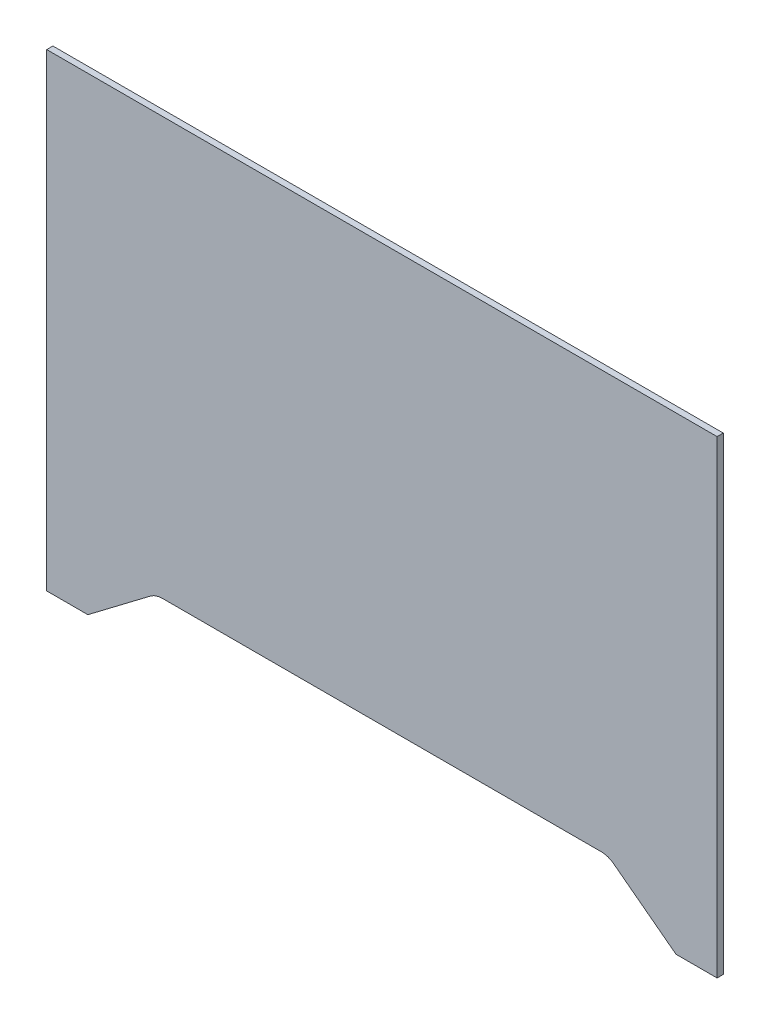
ISO-10303-21;
HEADER;
FILE_DESCRIPTION(('STEP AP214'),'2;1');
FILE_NAME('part.step','',(''),(''),'','','');
FILE_SCHEMA(('AUTOMOTIVE_DESIGN { 1 0 10303 214 1 1 1 1 }'));
ENDSEC;
DATA;
#1=APPLICATION_CONTEXT('core data for automotive mechanical design processes');
#2=APPLICATION_PROTOCOL_DEFINITION('international standard','automotive_design',2000,#1);
#3=PRODUCT_CONTEXT('',#1,'mechanical');
#4=PRODUCT('Part','Part','',(#3));
#5=PRODUCT_RELATED_PRODUCT_CATEGORY('part','',(#4));
#6=PRODUCT_DEFINITION_FORMATION('','',#4);
#7=PRODUCT_DEFINITION_CONTEXT('part definition',#1,'design');
#8=PRODUCT_DEFINITION('design','',#6,#7);
#9=PRODUCT_DEFINITION_SHAPE('','',#8);
#10=(LENGTH_UNIT() NAMED_UNIT(*) SI_UNIT(.MILLI.,.METRE.));
#11=(NAMED_UNIT(*) PLANE_ANGLE_UNIT() SI_UNIT($,.RADIAN.));
#12=(NAMED_UNIT(*) SI_UNIT($,.STERADIAN.) SOLID_ANGLE_UNIT());
#13=UNCERTAINTY_MEASURE_WITH_UNIT(LENGTH_MEASURE(1.E-05),#10,'distance_accuracy_value','');
#14=(GEOMETRIC_REPRESENTATION_CONTEXT(3) GLOBAL_UNCERTAINTY_ASSIGNED_CONTEXT((#13)) GLOBAL_UNIT_ASSIGNED_CONTEXT((#10,
#11,#12)) REPRESENTATION_CONTEXT('',''));
#15=CARTESIAN_POINT('',(0.,0.,0.));
#16=DIRECTION('',(0.,0.,1.));
#17=DIRECTION('',(1.,0.,0.));
#18=AXIS2_PLACEMENT_3D('',#15,#16,#17);
#19=CARTESIAN_POINT('',(163.,-114.,3.));
#20=DIRECTION('',(-1.,0.,0.));
#21=DIRECTION('',(0.,0.,1.));
#22=AXIS2_PLACEMENT_3D('',#19,#20,#21);
#23=PLANE('',#22);
#24=DIRECTION('',(0.,1.,0.));
#25=VECTOR('',#24,1.);
#26=CARTESIAN_POINT('',(163.,-114.,0.));
#27=LINE('',#26,#25);
#28=CARTESIAN_POINT('',(163.,-114.,0.));
#29=VERTEX_POINT('',#28);
#30=CARTESIAN_POINT('',(163.,114.,0.));
#31=VERTEX_POINT('',#30);
#32=EDGE_CURVE('E147',#29,#31,#27,.T.);
#33=ORIENTED_EDGE('',*,*,#32,.T.);
#34=DIRECTION('',(0.,0.,-1.));
#35=VECTOR('',#34,1.);
#36=CARTESIAN_POINT('',(163.,114.,3.));
#37=LINE('',#36,#35);
#38=CARTESIAN_POINT('',(163.,114.,3.));
#39=VERTEX_POINT('',#38);
#40=EDGE_CURVE('E11',#39,#31,#37,.T.);
#41=ORIENTED_EDGE('',*,*,#40,.F.);
#42=DIRECTION('',(0.,1.,0.));
#43=VECTOR('',#42,1.);
#44=CARTESIAN_POINT('',(163.,-114.,3.));
#45=LINE('',#44,#43);
#46=CARTESIAN_POINT('',(163.,-114.,3.));
#47=VERTEX_POINT('',#46);
#48=EDGE_CURVE('E165',#47,#39,#45,.T.);
#49=ORIENTED_EDGE('',*,*,#48,.F.);
#50=DIRECTION('',(0.,0.,-1.));
#51=VECTOR('',#50,1.);
#52=CARTESIAN_POINT('',(163.,-114.,3.));
#53=LINE('',#52,#51);
#54=EDGE_CURVE('E143',#47,#29,#53,.T.);
#55=ORIENTED_EDGE('',*,*,#54,.T.);
#56=EDGE_LOOP('',(#33,#41,#49,#55));
#57=FACE_BOUND('',#56,.T.);
#58=ADVANCED_FACE('F39',(#57),#23,.F.);
#59=CARTESIAN_POINT('',(-163.,114.,3.));
#60=DIRECTION('',(0.,-1.,0.));
#61=DIRECTION('',(0.,0.,-1.));
#62=AXIS2_PLACEMENT_3D('',#59,#60,#61);
#63=PLANE('',#62);
#64=DIRECTION('',(-1.,0.,0.));
#65=VECTOR('',#64,1.);
#66=CARTESIAN_POINT('',(-163.,114.,0.));
#67=LINE('',#66,#65);
#68=CARTESIAN_POINT('',(-163.,114.,0.));
#69=VERTEX_POINT('',#68);
#70=EDGE_CURVE('E150',#31,#69,#67,.T.);
#71=ORIENTED_EDGE('',*,*,#70,.T.);
#72=DIRECTION('',(0.,0.,-1.));
#73=VECTOR('',#72,1.);
#74=CARTESIAN_POINT('',(-163.,114.,3.));
#75=LINE('',#74,#73);
#76=CARTESIAN_POINT('',(-163.,114.,3.));
#77=VERTEX_POINT('',#76);
#78=EDGE_CURVE('E47',#77,#69,#75,.T.);
#79=ORIENTED_EDGE('',*,*,#78,.F.);
#80=DIRECTION('',(-1.,0.,0.));
#81=VECTOR('',#80,1.);
#82=CARTESIAN_POINT('',(-163.,114.,3.));
#83=LINE('',#82,#81);
#84=EDGE_CURVE('E104',#39,#77,#83,.T.);
#85=ORIENTED_EDGE('',*,*,#84,.F.);
#86=ORIENTED_EDGE('',*,*,#40,.T.);
#87=EDGE_LOOP('',(#71,#79,#85,#86));
#88=FACE_BOUND('',#87,.T.);
#89=ADVANCED_FACE('F214',(#88),#63,.F.);
#90=CARTESIAN_POINT('',(-163.,-114.,3.));
#91=DIRECTION('',(1.,0.,0.));
#92=DIRECTION('',(0.,0.,-1.));
#93=AXIS2_PLACEMENT_3D('',#90,#91,#92);
#94=PLANE('',#93);
#95=DIRECTION('',(0.,-1.,0.));
#96=VECTOR('',#95,1.);
#97=CARTESIAN_POINT('',(-163.,-114.,0.));
#98=LINE('',#97,#96);
#99=CARTESIAN_POINT('',(-163.,-114.,0.));
#100=VERTEX_POINT('',#99);
#101=EDGE_CURVE('E152',#69,#100,#98,.T.);
#102=ORIENTED_EDGE('',*,*,#101,.T.);
#103=DIRECTION('',(0.,0.,-1.));
#104=VECTOR('',#103,1.);
#105=CARTESIAN_POINT('',(-163.,-114.,3.));
#106=LINE('',#105,#104);
#107=CARTESIAN_POINT('',(-163.,-114.,3.));
#108=VERTEX_POINT('',#107);
#109=EDGE_CURVE('E178',#108,#100,#106,.T.);
#110=ORIENTED_EDGE('',*,*,#109,.F.);
#111=DIRECTION('',(0.,-1.,0.));
#112=VECTOR('',#111,1.);
#113=CARTESIAN_POINT('',(-163.,-114.,3.));
#114=LINE('',#113,#112);
#115=EDGE_CURVE('E186',#77,#108,#114,.T.);
#116=ORIENTED_EDGE('',*,*,#115,.F.);
#117=ORIENTED_EDGE('',*,*,#78,.T.);
#118=EDGE_LOOP('',(#102,#110,#116,#117));
#119=FACE_BOUND('',#118,.T.);
#120=ADVANCED_FACE('F184',(#119),#94,.F.);
#121=CARTESIAN_POINT('',(-143.,-114.,3.));
#122=DIRECTION('',(0.,1.,0.));
#123=DIRECTION('',(0.,0.,1.));
#124=AXIS2_PLACEMENT_3D('',#121,#122,#123);
#125=PLANE('',#124);
#126=DIRECTION('',(1.,0.,0.));
#127=VECTOR('',#126,1.);
#128=CARTESIAN_POINT('',(-143.,-114.,0.));
#129=LINE('',#128,#127);
#130=CARTESIAN_POINT('',(-143.,-114.,0.));
#131=VERTEX_POINT('',#130);
#132=EDGE_CURVE('E154',#100,#131,#129,.T.);
#133=ORIENTED_EDGE('',*,*,#132,.T.);
#134=DIRECTION('',(0.,0.,-1.));
#135=VECTOR('',#134,1.);
#136=CARTESIAN_POINT('',(-143.,-114.,3.));
#137=LINE('',#136,#135);
#138=CARTESIAN_POINT('',(-143.,-114.,3.));
#139=VERTEX_POINT('',#138);
#140=EDGE_CURVE('E175',#139,#131,#137,.T.);
#141=ORIENTED_EDGE('',*,*,#140,.F.);
#142=DIRECTION('',(1.,0.,0.));
#143=VECTOR('',#142,1.);
#144=CARTESIAN_POINT('',(-143.,-114.,3.));
#145=LINE('',#144,#143);
#146=EDGE_CURVE('E204',#108,#139,#145,.T.);
#147=ORIENTED_EDGE('',*,*,#146,.F.);
#148=ORIENTED_EDGE('',*,*,#109,.T.);
#149=EDGE_LOOP('',(#133,#141,#147,#148));
#150=FACE_BOUND('',#149,.T.);
#151=ADVANCED_FACE('F195',(#150),#125,.F.);
#152=CARTESIAN_POINT('',(-112.678383644367,-91.02907851846,3.));
#153=DIRECTION('',(-0.603857687995462,0.797092148154011,0.));
#154=DIRECTION('',(-0.797092148154011,-0.603857687995462,0.));
#155=AXIS2_PLACEMENT_3D('',#152,#153,#154);
#156=PLANE('',#155);
#157=DIRECTION('',(0.797092148154011,0.603857687995462,0.));
#158=VECTOR('',#157,1.);
#159=CARTESIAN_POINT('',(-112.678383644367,-91.02907851846,0.));
#160=LINE('',#159,#158);
#161=CARTESIAN_POINT('',(-112.678383644367,-91.02907851846,0.));
#162=VERTEX_POINT('',#161);
#163=EDGE_CURVE('E156',#131,#162,#160,.T.);
#164=ORIENTED_EDGE('',*,*,#163,.T.);
#165=DIRECTION('',(0.,0.,-1.));
#166=VECTOR('',#165,1.);
#167=CARTESIAN_POINT('',(-112.678383644367,-91.02907851846,3.));
#168=LINE('',#167,#166);
#169=CARTESIAN_POINT('',(-112.678383644367,-91.02907851846,3.));
#170=VERTEX_POINT('',#169);
#171=EDGE_CURVE('E172',#170,#162,#168,.T.);
#172=ORIENTED_EDGE('',*,*,#171,.F.);
#173=DIRECTION('',(0.797092148154011,0.603857687995462,0.));
#174=VECTOR('',#173,1.);
#175=CARTESIAN_POINT('',(-112.678383644367,-91.02907851846,3.));
#176=LINE('',#175,#174);
#177=EDGE_CURVE('E201',#139,#170,#176,.T.);
#178=ORIENTED_EDGE('',*,*,#177,.F.);
#179=ORIENTED_EDGE('',*,*,#140,.T.);
#180=EDGE_LOOP('',(#164,#172,#178,#179));
#181=FACE_BOUND('',#180,.T.);
#182=ADVANCED_FACE('F199',(#181),#156,.F.);
#183=CARTESIAN_POINT('',(-106.639806764412,-99.0000000000001,3.));
#184=DIRECTION('',(0.,0.,-1.));
#185=DIRECTION('',(-1.,0.,0.));
#186=AXIS2_PLACEMENT_3D('',#183,#184,#185);
#187=CYLINDRICAL_SURFACE('',#186,10.);
#188=CARTESIAN_POINT('',(-106.639806764412,-99.0000000000001,0.));
#189=DIRECTION('',(0.,0.,-1.));
#190=DIRECTION('',(-1.,0.,0.));
#191=AXIS2_PLACEMENT_3D('',#188,#189,#190);
#192=CIRCLE('',#191,10.);
#193=CARTESIAN_POINT('',(-106.639806764412,-89.0000000000001,0.));
#194=VERTEX_POINT('',#193);
#195=EDGE_CURVE('E158',#162,#194,#192,.T.);
#196=ORIENTED_EDGE('',*,*,#195,.T.);
#197=DIRECTION('',(0.,0.,-1.));
#198=VECTOR('',#197,1.);
#199=CARTESIAN_POINT('',(-106.639806764412,-89.0000000000001,3.));
#200=LINE('',#199,#198);
#201=CARTESIAN_POINT('',(-106.639806764412,-89.0000000000001,3.));
#202=VERTEX_POINT('',#201);
#203=EDGE_CURVE('E169',#202,#194,#200,.T.);
#204=ORIENTED_EDGE('',*,*,#203,.F.);
#205=CARTESIAN_POINT('',(-106.639806764412,-99.0000000000001,3.));
#206=DIRECTION('',(0.,0.,-1.));
#207=DIRECTION('',(-1.,0.,0.));
#208=AXIS2_PLACEMENT_3D('',#205,#206,#207);
#209=CIRCLE('',#208,10.);
#210=EDGE_CURVE('E203',#170,#202,#209,.T.);
#211=ORIENTED_EDGE('',*,*,#210,.F.);
#212=ORIENTED_EDGE('',*,*,#171,.T.);
#213=EDGE_LOOP('',(#196,#204,#211,#212));
#214=FACE_BOUND('',#213,.T.);
#215=ADVANCED_FACE('F226',(#214),#187,.F.);
#216=CARTESIAN_POINT('',(-106.639806764412,-89.0000000000001,3.));
#217=DIRECTION('',(0.,1.,0.));
#218=DIRECTION('',(0.,0.,1.));
#219=AXIS2_PLACEMENT_3D('',#216,#217,#218);
#220=PLANE('',#219);
#221=DIRECTION('',(1.,0.,0.));
#222=VECTOR('',#221,1.);
#223=CARTESIAN_POINT('',(-106.639806764412,-89.0000000000001,0.));
#224=LINE('',#223,#222);
#225=CARTESIAN_POINT('',(106.639806764412,-89.0000000000001,0.));
#226=VERTEX_POINT('',#225);
#227=EDGE_CURVE('E160',#194,#226,#224,.T.);
#228=ORIENTED_EDGE('',*,*,#227,.T.);
#229=DIRECTION('',(0.,0.,-1.));
#230=VECTOR('',#229,1.);
#231=CARTESIAN_POINT('',(106.639806764412,-89.0000000000001,3.));
#232=LINE('',#231,#230);
#233=CARTESIAN_POINT('',(106.639806764412,-89.0000000000001,3.));
#234=VERTEX_POINT('',#233);
#235=EDGE_CURVE('E138',#234,#226,#232,.T.);
#236=ORIENTED_EDGE('',*,*,#235,.F.);
#237=DIRECTION('',(1.,0.,0.));
#238=VECTOR('',#237,1.);
#239=CARTESIAN_POINT('',(-106.639806764412,-89.0000000000001,3.));
#240=LINE('',#239,#238);
#241=EDGE_CURVE('E129',#202,#234,#240,.T.);
#242=ORIENTED_EDGE('',*,*,#241,.F.);
#243=ORIENTED_EDGE('',*,*,#203,.T.);
#244=EDGE_LOOP('',(#228,#236,#242,#243));
#245=FACE_BOUND('',#244,.T.);
#246=ADVANCED_FACE('F229',(#245),#220,.F.);
#247=CARTESIAN_POINT('',(106.639806764412,-99.0000000000001,3.));
#248=DIRECTION('',(0.,0.,-1.));
#249=DIRECTION('',(-1.,0.,0.));
#250=AXIS2_PLACEMENT_3D('',#247,#248,#249);
#251=CYLINDRICAL_SURFACE('',#250,10.);
#252=CARTESIAN_POINT('',(106.639806764412,-99.0000000000001,0.));
#253=DIRECTION('',(0.,0.,-1.));
#254=DIRECTION('',(1.,0.,0.));
#255=AXIS2_PLACEMENT_3D('',#252,#253,#254);
#256=CIRCLE('',#255,10.);
#257=CARTESIAN_POINT('',(112.678383644367,-91.02907851846,0.));
#258=VERTEX_POINT('',#257);
#259=EDGE_CURVE('E137',#226,#258,#256,.T.);
#260=ORIENTED_EDGE('',*,*,#259,.T.);
#261=DIRECTION('',(0.,0.,-1.));
#262=VECTOR('',#261,1.);
#263=CARTESIAN_POINT('',(112.678383644367,-91.02907851846,3.));
#264=LINE('',#263,#262);
#265=CARTESIAN_POINT('',(112.678383644367,-91.02907851846,3.));
#266=VERTEX_POINT('',#265);
#267=EDGE_CURVE('E134',#266,#258,#264,.T.);
#268=ORIENTED_EDGE('',*,*,#267,.F.);
#269=CARTESIAN_POINT('',(106.639806764412,-99.0000000000001,3.));
#270=DIRECTION('',(0.,0.,-1.));
#271=DIRECTION('',(1.,0.,0.));
#272=AXIS2_PLACEMENT_3D('',#269,#270,#271);
#273=CIRCLE('',#272,10.);
#274=EDGE_CURVE('E123',#234,#266,#273,.T.);
#275=ORIENTED_EDGE('',*,*,#274,.F.);
#276=ORIENTED_EDGE('',*,*,#235,.T.);
#277=EDGE_LOOP('',(#260,#268,#275,#276));
#278=FACE_BOUND('',#277,.T.);
#279=ADVANCED_FACE('F135',(#278),#251,.F.);
#280=CARTESIAN_POINT('',(112.678383644367,-91.02907851846,3.));
#281=DIRECTION('',(0.603857687995462,0.797092148154011,0.));
#282=DIRECTION('',(-0.797092148154011,0.603857687995462,0.));
#283=AXIS2_PLACEMENT_3D('',#280,#281,#282);
#284=PLANE('',#283);
#285=DIRECTION('',(0.797092148154011,-0.603857687995462,0.));
#286=VECTOR('',#285,1.);
#287=CARTESIAN_POINT('',(112.678383644367,-91.02907851846,0.));
#288=LINE('',#287,#286);
#289=CARTESIAN_POINT('',(143.,-114.,0.));
#290=VERTEX_POINT('',#289);
#291=EDGE_CURVE('E90',#258,#290,#288,.T.);
#292=ORIENTED_EDGE('',*,*,#291,.T.);
#293=DIRECTION('',(0.,0.,-1.));
#294=VECTOR('',#293,1.);
#295=CARTESIAN_POINT('',(143.,-114.,3.));
#296=LINE('',#295,#294);
#297=CARTESIAN_POINT('',(143.,-114.,3.));
#298=VERTEX_POINT('',#297);
#299=EDGE_CURVE('E139',#298,#290,#296,.T.);
#300=ORIENTED_EDGE('',*,*,#299,.F.);
#301=DIRECTION('',(0.797092148154011,-0.603857687995462,0.));
#302=VECTOR('',#301,1.);
#303=CARTESIAN_POINT('',(112.678383644367,-91.02907851846,3.));
#304=LINE('',#303,#302);
#305=EDGE_CURVE('E127',#266,#298,#304,.T.);
#306=ORIENTED_EDGE('',*,*,#305,.F.);
#307=ORIENTED_EDGE('',*,*,#267,.T.);
#308=EDGE_LOOP('',(#292,#300,#306,#307));
#309=FACE_BOUND('',#308,.T.);
#310=ADVANCED_FACE('F141',(#309),#284,.F.);
#311=CARTESIAN_POINT('',(143.,-114.,3.));
#312=DIRECTION('',(0.,1.,0.));
#313=DIRECTION('',(0.,0.,1.));
#314=AXIS2_PLACEMENT_3D('',#311,#312,#313);
#315=PLANE('',#314);
#316=DIRECTION('',(1.,0.,0.));
#317=VECTOR('',#316,1.);
#318=CARTESIAN_POINT('',(143.,-114.,0.));
#319=LINE('',#318,#317);
#320=EDGE_CURVE('E96',#290,#29,#319,.T.);
#321=ORIENTED_EDGE('',*,*,#320,.T.);
#322=ORIENTED_EDGE('',*,*,#54,.F.);
#323=DIRECTION('',(1.,0.,0.));
#324=VECTOR('',#323,1.);
#325=CARTESIAN_POINT('',(143.,-114.,3.));
#326=LINE('',#325,#324);
#327=EDGE_CURVE('E55',#298,#47,#326,.T.);
#328=ORIENTED_EDGE('',*,*,#327,.F.);
#329=ORIENTED_EDGE('',*,*,#299,.T.);
#330=EDGE_LOOP('',(#321,#322,#328,#329));
#331=FACE_BOUND('',#330,.T.);
#332=ADVANCED_FACE('F238',(#331),#315,.F.);
#333=CARTESIAN_POINT('',(-106.639806764412,-99.0000000000001,3.));
#334=DIRECTION('',(0.,0.,-1.));
#335=DIRECTION('',(-1.,0.,0.));
#336=AXIS2_PLACEMENT_3D('',#333,#334,#335);
#337=PLANE('',#336);
#338=ORIENTED_EDGE('',*,*,#48,.T.);
#339=ORIENTED_EDGE('',*,*,#84,.T.);
#340=ORIENTED_EDGE('',*,*,#115,.T.);
#341=ORIENTED_EDGE('',*,*,#146,.T.);
#342=ORIENTED_EDGE('',*,*,#177,.T.);
#343=ORIENTED_EDGE('',*,*,#210,.T.);
#344=ORIENTED_EDGE('',*,*,#241,.T.);
#345=ORIENTED_EDGE('',*,*,#274,.T.);
#346=ORIENTED_EDGE('',*,*,#305,.T.);
#347=ORIENTED_EDGE('',*,*,#327,.T.);
#348=EDGE_LOOP('',(#338,#339,#340,#341,#342,#343,#344,#345,#346,#347));
#349=FACE_BOUND('',#348,.T.);
#350=ADVANCED_FACE('F125',(#349),#337,.F.);
#351=CARTESIAN_POINT('',(-106.639806764412,-99.0000000000001,0.));
#352=DIRECTION('',(0.,0.,-1.));
#353=DIRECTION('',(-1.,0.,0.));
#354=AXIS2_PLACEMENT_3D('',#351,#352,#353);
#355=PLANE('',#354);
#356=ORIENTED_EDGE('',*,*,#32,.F.);
#357=ORIENTED_EDGE('',*,*,#320,.F.);
#358=ORIENTED_EDGE('',*,*,#291,.F.);
#359=ORIENTED_EDGE('',*,*,#259,.F.);
#360=ORIENTED_EDGE('',*,*,#227,.F.);
#361=ORIENTED_EDGE('',*,*,#195,.F.);
#362=ORIENTED_EDGE('',*,*,#163,.F.);
#363=ORIENTED_EDGE('',*,*,#132,.F.);
#364=ORIENTED_EDGE('',*,*,#101,.F.);
#365=ORIENTED_EDGE('',*,*,#70,.F.);
#366=EDGE_LOOP('',(#356,#357,#358,#359,#360,#361,#362,#363,#364,#365));
#367=FACE_BOUND('',#366,.T.);
#368=ADVANCED_FACE('F190',(#367),#355,.T.);
#369=CLOSED_SHELL('',(#58,#89,#120,#151,#182,#215,#246,#279,#310,#332,#350,#368));
#370=MANIFOLD_SOLID_BREP('B2',#369);
#371=ADVANCED_BREP_SHAPE_REPRESENTATION('',(#18,#370),#14);
#372=SHAPE_DEFINITION_REPRESENTATION(#9,#371);
ENDSEC;
END-ISO-10303-21;
